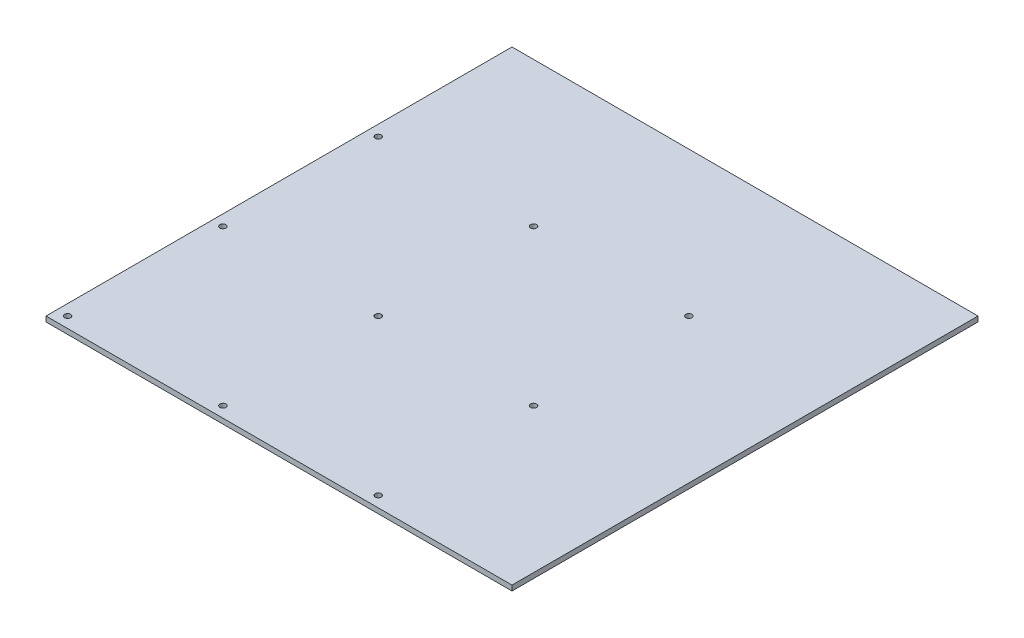
ISO-10303-21;
HEADER;
FILE_DESCRIPTION(('STEP AP214'),'2;1');
FILE_NAME('part.step','',(''),(''),'','','');
FILE_SCHEMA(('AUTOMOTIVE_DESIGN { 1 0 10303 214 1 1 1 1 }'));
ENDSEC;
DATA;
#1=APPLICATION_CONTEXT('core data for automotive mechanical design processes');
#2=APPLICATION_PROTOCOL_DEFINITION('international standard','automotive_design',2000,#1);
#3=PRODUCT_CONTEXT('',#1,'mechanical');
#4=PRODUCT('Part','Part','',(#3));
#5=PRODUCT_RELATED_PRODUCT_CATEGORY('part','',(#4));
#6=PRODUCT_DEFINITION_FORMATION('','',#4);
#7=PRODUCT_DEFINITION_CONTEXT('part definition',#1,'design');
#8=PRODUCT_DEFINITION('design','',#6,#7);
#9=PRODUCT_DEFINITION_SHAPE('','',#8);
#10=(LENGTH_UNIT() NAMED_UNIT(*) SI_UNIT(.MILLI.,.METRE.));
#11=(NAMED_UNIT(*) PLANE_ANGLE_UNIT() SI_UNIT($,.RADIAN.));
#12=(NAMED_UNIT(*) SI_UNIT($,.STERADIAN.) SOLID_ANGLE_UNIT());
#13=UNCERTAINTY_MEASURE_WITH_UNIT(LENGTH_MEASURE(1.E-05),#10,'distance_accuracy_value','');
#14=(GEOMETRIC_REPRESENTATION_CONTEXT(3) GLOBAL_UNCERTAINTY_ASSIGNED_CONTEXT((#13)) GLOBAL_UNIT_ASSIGNED_CONTEXT((#10,
#11,#12)) REPRESENTATION_CONTEXT('',''));
#15=CARTESIAN_POINT('',(0.,0.,0.));
#16=DIRECTION('',(0.,0.,1.));
#17=DIRECTION('',(1.,0.,0.));
#18=AXIS2_PLACEMENT_3D('',#15,#16,#17);
#19=CARTESIAN_POINT('',(0.,6.,0.));
#20=DIRECTION('',(0.,1.,0.));
#21=DIRECTION('',(0.,0.,1.));
#22=AXIS2_PLACEMENT_3D('',#19,#20,#21);
#23=PLANE('',#22);
#24=CARTESIAN_POINT('',(-257.500000000001,6.,77.5000000000001));
#25=DIRECTION('',(0.,1.,0.));
#26=DIRECTION('',(0.,0.,1.));
#27=AXIS2_PLACEMENT_3D('',#24,#25,#26);
#28=CIRCLE('',#27,3.50000000000002);
#29=CARTESIAN_POINT('',(-257.500000000001,6.,81.0000000000001));
#30=VERTEX_POINT('',#29);
#31=EDGE_CURVE('E152',#30,#30,#28,.T.);
#32=ORIENTED_EDGE('',*,*,#31,.F.);
#33=EDGE_LOOP('',(#32));
#34=FACE_BOUND('',#33,.T.);
#35=CARTESIAN_POINT('',(-77.5000000000012,6.,-102.5));
#36=DIRECTION('',(0.,1.,0.));
#37=DIRECTION('',(0.,0.,1.));
#38=AXIS2_PLACEMENT_3D('',#35,#36,#37);
#39=CIRCLE('',#38,3.50000000000001);
#40=CARTESIAN_POINT('',(-77.5000000000012,6.,-98.9999999999999));
#41=VERTEX_POINT('',#40);
#42=EDGE_CURVE('E140',#41,#41,#39,.T.);
#43=ORIENTED_EDGE('',*,*,#42,.F.);
#44=EDGE_LOOP('',(#43));
#45=FACE_BOUND('',#44,.T.);
#46=CARTESIAN_POINT('',(-77.5000000000006,6.,77.5000000000001));
#47=DIRECTION('',(0.,1.,0.));
#48=DIRECTION('',(0.,0.,1.));
#49=AXIS2_PLACEMENT_3D('',#46,#47,#48);
#50=CIRCLE('',#49,3.50000000000001);
#51=CARTESIAN_POINT('',(-77.5000000000006,6.,81.0000000000001));
#52=VERTEX_POINT('',#51);
#53=EDGE_CURVE('E128',#52,#52,#50,.T.);
#54=ORIENTED_EDGE('',*,*,#53,.F.);
#55=EDGE_LOOP('',(#54));
#56=FACE_BOUND('',#55,.T.);
#57=CARTESIAN_POINT('',(-77.5,6.,257.5));
#58=DIRECTION('',(0.,1.,0.));
#59=DIRECTION('',(0.,0.,1.));
#60=AXIS2_PLACEMENT_3D('',#57,#58,#59);
#61=CIRCLE('',#60,3.50000000000001);
#62=CARTESIAN_POINT('',(-77.5,6.,261.));
#63=VERTEX_POINT('',#62);
#64=EDGE_CURVE('E116',#63,#63,#61,.T.);
#65=ORIENTED_EDGE('',*,*,#64,.F.);
#66=EDGE_LOOP('',(#65));
#67=FACE_BOUND('',#66,.T.);
#68=DIRECTION('',(0.,0.,1.));
#69=VECTOR('',#68,1.);
#70=CARTESIAN_POINT('',(-270.,6.,270.));
#71=LINE('',#70,#69);
#72=CARTESIAN_POINT('',(-270.,6.,-270.));
#73=VERTEX_POINT('',#72);
#74=CARTESIAN_POINT('',(-270.,6.,270.));
#75=VERTEX_POINT('',#74);
#76=EDGE_CURVE('E86',#73,#75,#71,.T.);
#77=ORIENTED_EDGE('',*,*,#76,.T.);
#78=DIRECTION('',(1.,0.,0.));
#79=VECTOR('',#78,1.);
#80=CARTESIAN_POINT('',(270.,6.,270.));
#81=LINE('',#80,#79);
#82=CARTESIAN_POINT('',(270.,6.,270.));
#83=VERTEX_POINT('',#82);
#84=EDGE_CURVE('E81',#75,#83,#81,.T.);
#85=ORIENTED_EDGE('',*,*,#84,.T.);
#86=DIRECTION('',(0.,0.,-1.));
#87=VECTOR('',#86,1.);
#88=CARTESIAN_POINT('',(270.,6.,270.));
#89=LINE('',#88,#87);
#90=CARTESIAN_POINT('',(270.,6.,-270.));
#91=VERTEX_POINT('',#90);
#92=EDGE_CURVE('E84',#83,#91,#89,.T.);
#93=ORIENTED_EDGE('',*,*,#92,.T.);
#94=DIRECTION('',(-1.,0.,0.));
#95=VECTOR('',#94,1.);
#96=CARTESIAN_POINT('',(270.,6.,-270.));
#97=LINE('',#96,#95);
#98=EDGE_CURVE('E51',#91,#73,#97,.T.);
#99=ORIENTED_EDGE('',*,*,#98,.T.);
#100=EDGE_LOOP('',(#77,#85,#93,#99));
#101=FACE_BOUND('',#100,.T.);
#102=CARTESIAN_POINT('',(-257.5,6.,257.5));
#103=DIRECTION('',(0.,1.,0.));
#104=DIRECTION('',(0.,0.,1.));
#105=AXIS2_PLACEMENT_3D('',#102,#103,#104);
#106=CIRCLE('',#105,3.50000000000002);
#107=CARTESIAN_POINT('',(-257.5,6.,261.));
#108=VERTEX_POINT('',#107);
#109=EDGE_CURVE('E101',#108,#108,#106,.T.);
#110=ORIENTED_EDGE('',*,*,#109,.F.);
#111=EDGE_LOOP('',(#110));
#112=FACE_BOUND('',#111,.T.);
#113=CARTESIAN_POINT('',(102.5,6.,257.5));
#114=DIRECTION('',(0.,1.,0.));
#115=DIRECTION('',(0.,0.,1.));
#116=AXIS2_PLACEMENT_3D('',#113,#114,#115);
#117=CIRCLE('',#116,3.50000000000001);
#118=CARTESIAN_POINT('',(102.5,6.,261.));
#119=VERTEX_POINT('',#118);
#120=EDGE_CURVE('E122',#119,#119,#117,.T.);
#121=ORIENTED_EDGE('',*,*,#120,.F.);
#122=EDGE_LOOP('',(#121));
#123=FACE_BOUND('',#122,.T.);
#124=CARTESIAN_POINT('',(102.499999999999,6.,77.5000000000001));
#125=DIRECTION('',(0.,1.,0.));
#126=DIRECTION('',(0.,0.,1.));
#127=AXIS2_PLACEMENT_3D('',#124,#125,#126);
#128=CIRCLE('',#127,3.50000000000001);
#129=CARTESIAN_POINT('',(102.499999999999,6.,81.0000000000001));
#130=VERTEX_POINT('',#129);
#131=EDGE_CURVE('E134',#130,#130,#128,.T.);
#132=ORIENTED_EDGE('',*,*,#131,.F.);
#133=EDGE_LOOP('',(#132));
#134=FACE_BOUND('',#133,.T.);
#135=CARTESIAN_POINT('',(102.499999999999,6.,-102.5));
#136=DIRECTION('',(0.,1.,0.));
#137=DIRECTION('',(0.,0.,1.));
#138=AXIS2_PLACEMENT_3D('',#135,#136,#137);
#139=CIRCLE('',#138,3.50000000000001);
#140=CARTESIAN_POINT('',(102.499999999999,6.,-98.9999999999999));
#141=VERTEX_POINT('',#140);
#142=EDGE_CURVE('E146',#141,#141,#139,.T.);
#143=ORIENTED_EDGE('',*,*,#142,.F.);
#144=EDGE_LOOP('',(#143));
#145=FACE_BOUND('',#144,.T.);
#146=CARTESIAN_POINT('',(-257.500000000001,6.,-102.5));
#147=DIRECTION('',(0.,1.,0.));
#148=DIRECTION('',(0.,0.,1.));
#149=AXIS2_PLACEMENT_3D('',#146,#147,#148);
#150=CIRCLE('',#149,3.50000000000002);
#151=CARTESIAN_POINT('',(-257.500000000001,6.,-98.9999999999999));
#152=VERTEX_POINT('',#151);
#153=EDGE_CURVE('E158',#152,#152,#150,.T.);
#154=ORIENTED_EDGE('',*,*,#153,.F.);
#155=EDGE_LOOP('',(#154));
#156=FACE_BOUND('',#155,.T.);
#157=ADVANCED_FACE('F34',(#34,#45,#56,#67,#101,#112,#123,#134,#145,#156),#23,.T.);
#158=CARTESIAN_POINT('',(0.,0.,0.));
#159=DIRECTION('',(0.,1.,0.));
#160=DIRECTION('',(0.,0.,1.));
#161=AXIS2_PLACEMENT_3D('',#158,#159,#160);
#162=PLANE('',#161);
#163=DIRECTION('',(0.,0.,1.));
#164=VECTOR('',#163,1.);
#165=CARTESIAN_POINT('',(-270.,0.,270.));
#166=LINE('',#165,#164);
#167=CARTESIAN_POINT('',(-270.,0.,-270.));
#168=VERTEX_POINT('',#167);
#169=CARTESIAN_POINT('',(-270.,0.,270.));
#170=VERTEX_POINT('',#169);
#171=EDGE_CURVE('E98',#168,#170,#166,.T.);
#172=ORIENTED_EDGE('',*,*,#171,.F.);
#173=DIRECTION('',(-1.,0.,0.));
#174=VECTOR('',#173,1.);
#175=CARTESIAN_POINT('',(270.,0.,-270.));
#176=LINE('',#175,#174);
#177=CARTESIAN_POINT('',(270.,0.,-270.));
#178=VERTEX_POINT('',#177);
#179=EDGE_CURVE('E74',#178,#168,#176,.T.);
#180=ORIENTED_EDGE('',*,*,#179,.F.);
#181=DIRECTION('',(0.,0.,-1.));
#182=VECTOR('',#181,1.);
#183=CARTESIAN_POINT('',(270.,0.,270.));
#184=LINE('',#183,#182);
#185=CARTESIAN_POINT('',(270.,0.,270.));
#186=VERTEX_POINT('',#185);
#187=EDGE_CURVE('E68',#186,#178,#184,.T.);
#188=ORIENTED_EDGE('',*,*,#187,.F.);
#189=DIRECTION('',(1.,0.,0.));
#190=VECTOR('',#189,1.);
#191=CARTESIAN_POINT('',(270.,0.,270.));
#192=LINE('',#191,#190);
#193=EDGE_CURVE('E90',#170,#186,#192,.T.);
#194=ORIENTED_EDGE('',*,*,#193,.F.);
#195=EDGE_LOOP('',(#172,#180,#188,#194));
#196=FACE_BOUND('',#195,.T.);
#197=CARTESIAN_POINT('',(-257.5,0.,257.5));
#198=DIRECTION('',(0.,1.,0.));
#199=DIRECTION('',(0.,0.,1.));
#200=AXIS2_PLACEMENT_3D('',#197,#198,#199);
#201=CIRCLE('',#200,3.50000000000002);
#202=CARTESIAN_POINT('',(-257.5,0.,261.));
#203=VERTEX_POINT('',#202);
#204=EDGE_CURVE('E113',#203,#203,#201,.T.);
#205=ORIENTED_EDGE('',*,*,#204,.T.);
#206=EDGE_LOOP('',(#205));
#207=FACE_BOUND('',#206,.T.);
#208=CARTESIAN_POINT('',(-77.5,0.,257.5));
#209=DIRECTION('',(0.,1.,0.));
#210=DIRECTION('',(0.,0.,1.));
#211=AXIS2_PLACEMENT_3D('',#208,#209,#210);
#212=CIRCLE('',#211,3.50000000000001);
#213=CARTESIAN_POINT('',(-77.5,0.,261.));
#214=VERTEX_POINT('',#213);
#215=EDGE_CURVE('E119',#214,#214,#212,.T.);
#216=ORIENTED_EDGE('',*,*,#215,.T.);
#217=EDGE_LOOP('',(#216));
#218=FACE_BOUND('',#217,.T.);
#219=CARTESIAN_POINT('',(102.5,0.,257.5));
#220=DIRECTION('',(0.,1.,0.));
#221=DIRECTION('',(0.,0.,1.));
#222=AXIS2_PLACEMENT_3D('',#219,#220,#221);
#223=CIRCLE('',#222,3.50000000000001);
#224=CARTESIAN_POINT('',(102.5,0.,261.));
#225=VERTEX_POINT('',#224);
#226=EDGE_CURVE('E125',#225,#225,#223,.T.);
#227=ORIENTED_EDGE('',*,*,#226,.T.);
#228=EDGE_LOOP('',(#227));
#229=FACE_BOUND('',#228,.T.);
#230=CARTESIAN_POINT('',(-77.5000000000006,0.,77.5000000000001));
#231=DIRECTION('',(0.,1.,0.));
#232=DIRECTION('',(0.,0.,1.));
#233=AXIS2_PLACEMENT_3D('',#230,#231,#232);
#234=CIRCLE('',#233,3.50000000000001);
#235=CARTESIAN_POINT('',(-77.5000000000006,0.,81.0000000000001));
#236=VERTEX_POINT('',#235);
#237=EDGE_CURVE('E131',#236,#236,#234,.T.);
#238=ORIENTED_EDGE('',*,*,#237,.T.);
#239=EDGE_LOOP('',(#238));
#240=FACE_BOUND('',#239,.T.);
#241=CARTESIAN_POINT('',(102.499999999999,0.,77.5000000000001));
#242=DIRECTION('',(0.,1.,0.));
#243=DIRECTION('',(0.,0.,1.));
#244=AXIS2_PLACEMENT_3D('',#241,#242,#243);
#245=CIRCLE('',#244,3.50000000000001);
#246=CARTESIAN_POINT('',(102.499999999999,0.,81.0000000000001));
#247=VERTEX_POINT('',#246);
#248=EDGE_CURVE('E137',#247,#247,#245,.T.);
#249=ORIENTED_EDGE('',*,*,#248,.T.);
#250=EDGE_LOOP('',(#249));
#251=FACE_BOUND('',#250,.T.);
#252=CARTESIAN_POINT('',(-77.5000000000012,0.,-102.5));
#253=DIRECTION('',(0.,1.,0.));
#254=DIRECTION('',(0.,0.,1.));
#255=AXIS2_PLACEMENT_3D('',#252,#253,#254);
#256=CIRCLE('',#255,3.50000000000001);
#257=CARTESIAN_POINT('',(-77.5000000000012,0.,-98.9999999999999));
#258=VERTEX_POINT('',#257);
#259=EDGE_CURVE('E143',#258,#258,#256,.T.);
#260=ORIENTED_EDGE('',*,*,#259,.T.);
#261=EDGE_LOOP('',(#260));
#262=FACE_BOUND('',#261,.T.);
#263=CARTESIAN_POINT('',(102.499999999999,0.,-102.5));
#264=DIRECTION('',(0.,1.,0.));
#265=DIRECTION('',(0.,0.,1.));
#266=AXIS2_PLACEMENT_3D('',#263,#264,#265);
#267=CIRCLE('',#266,3.50000000000001);
#268=CARTESIAN_POINT('',(102.499999999999,0.,-98.9999999999999));
#269=VERTEX_POINT('',#268);
#270=EDGE_CURVE('E149',#269,#269,#267,.T.);
#271=ORIENTED_EDGE('',*,*,#270,.T.);
#272=EDGE_LOOP('',(#271));
#273=FACE_BOUND('',#272,.T.);
#274=CARTESIAN_POINT('',(-257.500000000001,0.,77.5000000000001));
#275=DIRECTION('',(0.,1.,0.));
#276=DIRECTION('',(0.,0.,1.));
#277=AXIS2_PLACEMENT_3D('',#274,#275,#276);
#278=CIRCLE('',#277,3.50000000000002);
#279=CARTESIAN_POINT('',(-257.500000000001,0.,81.0000000000001));
#280=VERTEX_POINT('',#279);
#281=EDGE_CURVE('E155',#280,#280,#278,.T.);
#282=ORIENTED_EDGE('',*,*,#281,.T.);
#283=EDGE_LOOP('',(#282));
#284=FACE_BOUND('',#283,.T.);
#285=CARTESIAN_POINT('',(-257.500000000001,0.,-102.5));
#286=DIRECTION('',(0.,1.,0.));
#287=DIRECTION('',(0.,0.,1.));
#288=AXIS2_PLACEMENT_3D('',#285,#286,#287);
#289=CIRCLE('',#288,3.50000000000002);
#290=CARTESIAN_POINT('',(-257.500000000001,0.,-98.9999999999999));
#291=VERTEX_POINT('',#290);
#292=EDGE_CURVE('E161',#291,#291,#289,.T.);
#293=ORIENTED_EDGE('',*,*,#292,.T.);
#294=EDGE_LOOP('',(#293));
#295=FACE_BOUND('',#294,.T.);
#296=ADVANCED_FACE('F109',(#196,#207,#218,#229,#240,#251,#262,#273,#284,#295),#162,.F.);
#297=CARTESIAN_POINT('',(-270.,6.,270.));
#298=DIRECTION('',(1.,0.,0.));
#299=DIRECTION('',(0.,0.,-1.));
#300=AXIS2_PLACEMENT_3D('',#297,#298,#299);
#301=PLANE('',#300);
#302=ORIENTED_EDGE('',*,*,#171,.T.);
#303=DIRECTION('',(0.,-1.,0.));
#304=VECTOR('',#303,1.);
#305=CARTESIAN_POINT('',(-270.,6.,270.));
#306=LINE('',#305,#304);
#307=EDGE_CURVE('E11',#75,#170,#306,.T.);
#308=ORIENTED_EDGE('',*,*,#307,.F.);
#309=ORIENTED_EDGE('',*,*,#76,.F.);
#310=DIRECTION('',(0.,-1.,0.));
#311=VECTOR('',#310,1.);
#312=CARTESIAN_POINT('',(-270.,6.,-270.));
#313=LINE('',#312,#311);
#314=EDGE_CURVE('E94',#73,#168,#313,.T.);
#315=ORIENTED_EDGE('',*,*,#314,.T.);
#316=EDGE_LOOP('',(#302,#308,#309,#315));
#317=FACE_BOUND('',#316,.T.);
#318=ADVANCED_FACE('F36',(#317),#301,.F.);
#319=CARTESIAN_POINT('',(270.,6.,270.));
#320=DIRECTION('',(0.,0.,-1.));
#321=DIRECTION('',(-1.,0.,0.));
#322=AXIS2_PLACEMENT_3D('',#319,#320,#321);
#323=PLANE('',#322);
#324=ORIENTED_EDGE('',*,*,#193,.T.);
#325=DIRECTION('',(0.,-1.,0.));
#326=VECTOR('',#325,1.);
#327=CARTESIAN_POINT('',(270.,6.,270.));
#328=LINE('',#327,#326);
#329=EDGE_CURVE('E43',#83,#186,#328,.T.);
#330=ORIENTED_EDGE('',*,*,#329,.F.);
#331=ORIENTED_EDGE('',*,*,#84,.F.);
#332=ORIENTED_EDGE('',*,*,#307,.T.);
#333=EDGE_LOOP('',(#324,#330,#331,#332));
#334=FACE_BOUND('',#333,.T.);
#335=ADVANCED_FACE('F89',(#334),#323,.F.);
#336=CARTESIAN_POINT('',(270.,6.,270.));
#337=DIRECTION('',(-1.,0.,0.));
#338=DIRECTION('',(0.,0.,1.));
#339=AXIS2_PLACEMENT_3D('',#336,#337,#338);
#340=PLANE('',#339);
#341=ORIENTED_EDGE('',*,*,#187,.T.);
#342=DIRECTION('',(0.,-1.,0.));
#343=VECTOR('',#342,1.);
#344=CARTESIAN_POINT('',(270.,6.,-270.));
#345=LINE('',#344,#343);
#346=EDGE_CURVE('E91',#91,#178,#345,.T.);
#347=ORIENTED_EDGE('',*,*,#346,.F.);
#348=ORIENTED_EDGE('',*,*,#92,.F.);
#349=ORIENTED_EDGE('',*,*,#329,.T.);
#350=EDGE_LOOP('',(#341,#347,#348,#349));
#351=FACE_BOUND('',#350,.T.);
#352=ADVANCED_FACE('F92',(#351),#340,.F.);
#353=CARTESIAN_POINT('',(270.,6.,-270.));
#354=DIRECTION('',(0.,0.,1.));
#355=DIRECTION('',(1.,0.,0.));
#356=AXIS2_PLACEMENT_3D('',#353,#354,#355);
#357=PLANE('',#356);
#358=ORIENTED_EDGE('',*,*,#179,.T.);
#359=ORIENTED_EDGE('',*,*,#314,.F.);
#360=ORIENTED_EDGE('',*,*,#98,.F.);
#361=ORIENTED_EDGE('',*,*,#346,.T.);
#362=EDGE_LOOP('',(#358,#359,#360,#361));
#363=FACE_BOUND('',#362,.T.);
#364=ADVANCED_FACE('F106',(#363),#357,.F.);
#365=CARTESIAN_POINT('',(-257.5,6.,257.5));
#366=DIRECTION('',(0.,-1.,0.));
#367=DIRECTION('',(0.,0.,-1.));
#368=AXIS2_PLACEMENT_3D('',#365,#366,#367);
#369=CYLINDRICAL_SURFACE('',#368,3.50000000000002);
#370=ORIENTED_EDGE('',*,*,#109,.T.);
#371=EDGE_LOOP('',(#370));
#372=FACE_BOUND('',#371,.T.);
#373=ORIENTED_EDGE('',*,*,#204,.F.);
#374=EDGE_LOOP('',(#373));
#375=FACE_BOUND('',#374,.T.);
#376=ADVANCED_FACE('F180',(#372,#375),#369,.F.);
#377=CARTESIAN_POINT('',(-77.5,6.,257.5));
#378=DIRECTION('',(0.,-1.,0.));
#379=DIRECTION('',(0.,0.,-1.));
#380=AXIS2_PLACEMENT_3D('',#377,#378,#379);
#381=CYLINDRICAL_SURFACE('',#380,3.50000000000001);
#382=ORIENTED_EDGE('',*,*,#64,.T.);
#383=EDGE_LOOP('',(#382));
#384=FACE_BOUND('',#383,.T.);
#385=ORIENTED_EDGE('',*,*,#215,.F.);
#386=EDGE_LOOP('',(#385));
#387=FACE_BOUND('',#386,.T.);
#388=ADVANCED_FACE('F226',(#384,#387),#381,.F.);
#389=CARTESIAN_POINT('',(102.5,6.,257.5));
#390=DIRECTION('',(0.,-1.,0.));
#391=DIRECTION('',(0.,0.,-1.));
#392=AXIS2_PLACEMENT_3D('',#389,#390,#391);
#393=CYLINDRICAL_SURFACE('',#392,3.50000000000001);
#394=ORIENTED_EDGE('',*,*,#120,.T.);
#395=EDGE_LOOP('',(#394));
#396=FACE_BOUND('',#395,.T.);
#397=ORIENTED_EDGE('',*,*,#226,.F.);
#398=EDGE_LOOP('',(#397));
#399=FACE_BOUND('',#398,.T.);
#400=ADVANCED_FACE('F234',(#396,#399),#393,.F.);
#401=CARTESIAN_POINT('',(-77.5000000000006,6.,77.5000000000001));
#402=DIRECTION('',(0.,-1.,0.));
#403=DIRECTION('',(0.,0.,-1.));
#404=AXIS2_PLACEMENT_3D('',#401,#402,#403);
#405=CYLINDRICAL_SURFACE('',#404,3.50000000000001);
#406=ORIENTED_EDGE('',*,*,#53,.T.);
#407=EDGE_LOOP('',(#406));
#408=FACE_BOUND('',#407,.T.);
#409=ORIENTED_EDGE('',*,*,#237,.F.);
#410=EDGE_LOOP('',(#409));
#411=FACE_BOUND('',#410,.T.);
#412=ADVANCED_FACE('F242',(#408,#411),#405,.F.);
#413=CARTESIAN_POINT('',(102.499999999999,6.,77.5000000000001));
#414=DIRECTION('',(0.,-1.,0.));
#415=DIRECTION('',(0.,0.,-1.));
#416=AXIS2_PLACEMENT_3D('',#413,#414,#415);
#417=CYLINDRICAL_SURFACE('',#416,3.50000000000001);
#418=ORIENTED_EDGE('',*,*,#131,.T.);
#419=EDGE_LOOP('',(#418));
#420=FACE_BOUND('',#419,.T.);
#421=ORIENTED_EDGE('',*,*,#248,.F.);
#422=EDGE_LOOP('',(#421));
#423=FACE_BOUND('',#422,.T.);
#424=ADVANCED_FACE('F251',(#420,#423),#417,.F.);
#425=CARTESIAN_POINT('',(-77.5000000000012,6.,-102.5));
#426=DIRECTION('',(0.,-1.,0.));
#427=DIRECTION('',(0.,0.,-1.));
#428=AXIS2_PLACEMENT_3D('',#425,#426,#427);
#429=CYLINDRICAL_SURFACE('',#428,3.50000000000001);
#430=ORIENTED_EDGE('',*,*,#42,.T.);
#431=EDGE_LOOP('',(#430));
#432=FACE_BOUND('',#431,.T.);
#433=ORIENTED_EDGE('',*,*,#259,.F.);
#434=EDGE_LOOP('',(#433));
#435=FACE_BOUND('',#434,.T.);
#436=ADVANCED_FACE('F260',(#432,#435),#429,.F.);
#437=CARTESIAN_POINT('',(102.499999999999,6.,-102.5));
#438=DIRECTION('',(0.,-1.,0.));
#439=DIRECTION('',(0.,0.,-1.));
#440=AXIS2_PLACEMENT_3D('',#437,#438,#439);
#441=CYLINDRICAL_SURFACE('',#440,3.50000000000001);
#442=ORIENTED_EDGE('',*,*,#142,.T.);
#443=EDGE_LOOP('',(#442));
#444=FACE_BOUND('',#443,.T.);
#445=ORIENTED_EDGE('',*,*,#270,.F.);
#446=EDGE_LOOP('',(#445));
#447=FACE_BOUND('',#446,.T.);
#448=ADVANCED_FACE('F269',(#444,#447),#441,.F.);
#449=CARTESIAN_POINT('',(-257.500000000001,6.,77.5000000000001));
#450=DIRECTION('',(0.,-1.,0.));
#451=DIRECTION('',(0.,0.,-1.));
#452=AXIS2_PLACEMENT_3D('',#449,#450,#451);
#453=CYLINDRICAL_SURFACE('',#452,3.50000000000002);
#454=ORIENTED_EDGE('',*,*,#31,.T.);
#455=EDGE_LOOP('',(#454));
#456=FACE_BOUND('',#455,.T.);
#457=ORIENTED_EDGE('',*,*,#281,.F.);
#458=EDGE_LOOP('',(#457));
#459=FACE_BOUND('',#458,.T.);
#460=ADVANCED_FACE('F278',(#456,#459),#453,.F.);
#461=CARTESIAN_POINT('',(-257.500000000001,6.,-102.5));
#462=DIRECTION('',(0.,-1.,0.));
#463=DIRECTION('',(0.,0.,-1.));
#464=AXIS2_PLACEMENT_3D('',#461,#462,#463);
#465=CYLINDRICAL_SURFACE('',#464,3.50000000000002);
#466=ORIENTED_EDGE('',*,*,#153,.T.);
#467=EDGE_LOOP('',(#466));
#468=FACE_BOUND('',#467,.T.);
#469=ORIENTED_EDGE('',*,*,#292,.F.);
#470=EDGE_LOOP('',(#469));
#471=FACE_BOUND('',#470,.T.);
#472=ADVANCED_FACE('F167',(#468,#471),#465,.F.);
#473=CLOSED_SHELL('',(#157,#296,#318,#335,#352,#364,#376,#388,#400,#412,#424,#436,#448,#460,#472));
#474=MANIFOLD_SOLID_BREP('B2',#473);
#475=ADVANCED_BREP_SHAPE_REPRESENTATION('',(#18,#474),#14);
#476=SHAPE_DEFINITION_REPRESENTATION(#9,#475);
ENDSEC;
END-ISO-10303-21;
